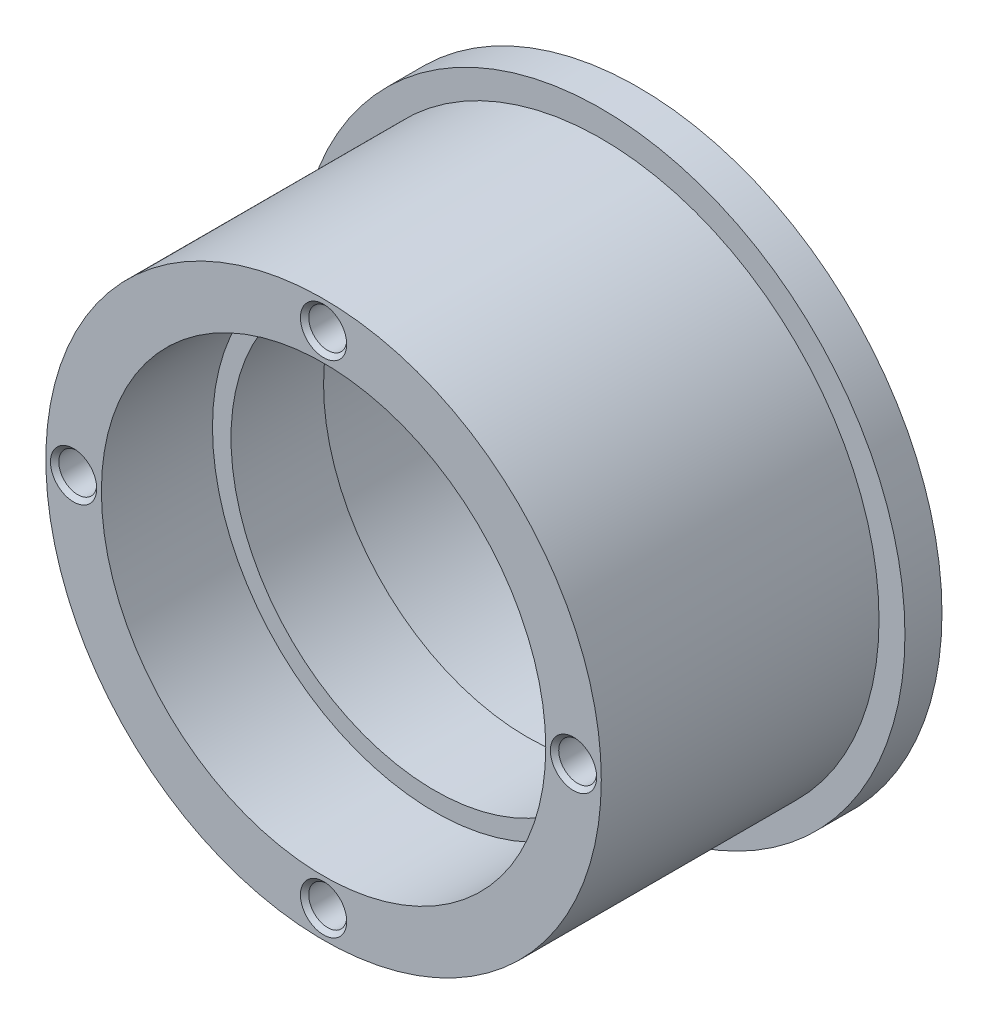
ISO-10303-21;
HEADER;
FILE_DESCRIPTION(('STEP AP214'),'2;1');
FILE_NAME('part.step','',(''),(''),'','','');
FILE_SCHEMA(('AUTOMOTIVE_DESIGN { 1 0 10303 214 1 1 1 1 }'));
ENDSEC;
DATA;
#1=APPLICATION_CONTEXT('core data for automotive mechanical design processes');
#2=APPLICATION_PROTOCOL_DEFINITION('international standard','automotive_design',2000,#1);
#3=PRODUCT_CONTEXT('',#1,'mechanical');
#4=PRODUCT('Part','Part','',(#3));
#5=PRODUCT_RELATED_PRODUCT_CATEGORY('part','',(#4));
#6=PRODUCT_DEFINITION_FORMATION('','',#4);
#7=PRODUCT_DEFINITION_CONTEXT('part definition',#1,'design');
#8=PRODUCT_DEFINITION('design','',#6,#7);
#9=PRODUCT_DEFINITION_SHAPE('','',#8);
#10=(LENGTH_UNIT() NAMED_UNIT(*) SI_UNIT(.MILLI.,.METRE.));
#11=(NAMED_UNIT(*) PLANE_ANGLE_UNIT() SI_UNIT($,.RADIAN.));
#12=(NAMED_UNIT(*) SI_UNIT($,.STERADIAN.) SOLID_ANGLE_UNIT());
#13=UNCERTAINTY_MEASURE_WITH_UNIT(LENGTH_MEASURE(1.E-05),#10,'distance_accuracy_value','');
#14=(GEOMETRIC_REPRESENTATION_CONTEXT(3) GLOBAL_UNCERTAINTY_ASSIGNED_CONTEXT((#13)) GLOBAL_UNIT_ASSIGNED_CONTEXT((#10,
#11,#12)) REPRESENTATION_CONTEXT('',''));
#15=CARTESIAN_POINT('',(0.,0.,0.));
#16=DIRECTION('',(0.,0.,1.));
#17=DIRECTION('',(1.,0.,0.));
#18=AXIS2_PLACEMENT_3D('',#15,#16,#17);
#19=CARTESIAN_POINT('',(0.,13.5,8.5));
#20=DIRECTION('',(0.,0.,1.));
#21=DIRECTION('',(1.,0.,0.));
#22=AXIS2_PLACEMENT_3D('',#19,#20,#21);
#23=CONICAL_SURFACE('',#22,1.25,0.785398162500002);
#24=CARTESIAN_POINT('',(0.,13.5,8.5));
#25=DIRECTION('',(0.,0.,-1.));
#26=DIRECTION('',(1.,0.,0.));
#27=AXIS2_PLACEMENT_3D('',#24,#25,#26);
#28=CIRCLE('',#27,1.25);
#29=CARTESIAN_POINT('',(1.25000000000005,13.5,8.5));
#30=VERTEX_POINT('',#29);
#31=EDGE_CURVE('E164',#30,#30,#28,.T.);
#32=ORIENTED_EDGE('',*,*,#31,.F.);
#33=EDGE_LOOP('',(#32));
#34=FACE_BOUND('',#33,.T.);
#35=CARTESIAN_POINT('',(0.,13.5,8.275));
#36=DIRECTION('',(0.,0.,1.));
#37=DIRECTION('',(1.,0.,0.));
#38=AXIS2_PLACEMENT_3D('',#35,#36,#37);
#39=CIRCLE('',#38,1.025);
#40=CARTESIAN_POINT('',(1.02500000000005,13.5,8.275));
#41=VERTEX_POINT('',#40);
#42=EDGE_CURVE('E11',#41,#41,#39,.T.);
#43=ORIENTED_EDGE('',*,*,#42,.F.);
#44=EDGE_LOOP('',(#43));
#45=FACE_BOUND('',#44,.T.);
#46=ADVANCED_FACE('F16',(#34,#45),#23,.F.);
#47=CARTESIAN_POINT('',(0.,13.5,8.5));
#48=DIRECTION('',(0.,0.,-1.));
#49=DIRECTION('',(-1.,0.,0.));
#50=AXIS2_PLACEMENT_3D('',#47,#48,#49);
#51=CYLINDRICAL_SURFACE('',#50,1.025);
#52=CARTESIAN_POINT('',(0.,13.5,3.5));
#53=DIRECTION('',(0.,0.,1.));
#54=DIRECTION('',(-1.,0.,0.));
#55=AXIS2_PLACEMENT_3D('',#52,#53,#54);
#56=CIRCLE('',#55,1.025);
#57=CARTESIAN_POINT('',(-1.02499999999995,13.5,3.5));
#58=VERTEX_POINT('',#57);
#59=EDGE_CURVE('E27',#58,#58,#56,.T.);
#60=ORIENTED_EDGE('',*,*,#59,.F.);
#61=EDGE_LOOP('',(#60));
#62=FACE_BOUND('',#61,.T.);
#63=ORIENTED_EDGE('',*,*,#42,.T.);
#64=EDGE_LOOP('',(#63));
#65=FACE_BOUND('',#64,.T.);
#66=ADVANCED_FACE('F345',(#62,#65),#51,.F.);
#67=CARTESIAN_POINT('',(0.,13.5,3.5));
#68=DIRECTION('',(0.,0.,1.));
#69=DIRECTION('',(1.,0.,0.));
#70=AXIS2_PLACEMENT_3D('',#67,#68,#69);
#71=CONICAL_SURFACE('',#70,1.025,1.0297442575);
#72=CARTESIAN_POINT('',(0.,13.5,2.88411786549675));
#73=VERTEX_POINT('',#72);
#74=VERTEX_LOOP('',#73);
#75=FACE_BOUND('',#74,.T.);
#76=ORIENTED_EDGE('',*,*,#59,.T.);
#77=EDGE_LOOP('',(#76));
#78=FACE_BOUND('',#77,.T.);
#79=ADVANCED_FACE('F306',(#75,#78),#71,.F.);
#80=CARTESIAN_POINT('',(13.5,0.,8.5));
#81=DIRECTION('',(0.,0.,1.));
#82=DIRECTION('',(1.,0.,0.));
#83=AXIS2_PLACEMENT_3D('',#80,#81,#82);
#84=CONICAL_SURFACE('',#83,1.25,0.7853981625);
#85=CARTESIAN_POINT('',(13.5,0.,8.5));
#86=DIRECTION('',(0.,0.,-1.));
#87=DIRECTION('',(1.,0.,0.));
#88=AXIS2_PLACEMENT_3D('',#85,#86,#87);
#89=CIRCLE('',#88,1.25);
#90=CARTESIAN_POINT('',(14.75,0.,8.5));
#91=VERTEX_POINT('',#90);
#92=EDGE_CURVE('E167',#91,#91,#89,.T.);
#93=ORIENTED_EDGE('',*,*,#92,.F.);
#94=EDGE_LOOP('',(#93));
#95=FACE_BOUND('',#94,.T.);
#96=CARTESIAN_POINT('',(13.5,0.,8.275));
#97=DIRECTION('',(0.,0.,1.));
#98=DIRECTION('',(1.,0.,0.));
#99=AXIS2_PLACEMENT_3D('',#96,#97,#98);
#100=CIRCLE('',#99,1.025);
#101=CARTESIAN_POINT('',(14.525,0.,8.275));
#102=VERTEX_POINT('',#101);
#103=EDGE_CURVE('E144',#102,#102,#100,.T.);
#104=ORIENTED_EDGE('',*,*,#103,.F.);
#105=EDGE_LOOP('',(#104));
#106=FACE_BOUND('',#105,.T.);
#107=ADVANCED_FACE('F300',(#95,#106),#84,.F.);
#108=CARTESIAN_POINT('',(13.5,0.,8.5));
#109=DIRECTION('',(0.,0.,-1.));
#110=DIRECTION('',(-1.,0.,0.));
#111=AXIS2_PLACEMENT_3D('',#108,#109,#110);
#112=CYLINDRICAL_SURFACE('',#111,1.025);
#113=CARTESIAN_POINT('',(13.5,0.,3.5));
#114=DIRECTION('',(0.,0.,1.));
#115=DIRECTION('',(-1.,0.,0.));
#116=AXIS2_PLACEMENT_3D('',#113,#114,#115);
#117=CIRCLE('',#116,1.025);
#118=CARTESIAN_POINT('',(12.475,0.,3.5));
#119=VERTEX_POINT('',#118);
#120=EDGE_CURVE('E146',#119,#119,#117,.T.);
#121=ORIENTED_EDGE('',*,*,#120,.F.);
#122=EDGE_LOOP('',(#121));
#123=FACE_BOUND('',#122,.T.);
#124=ORIENTED_EDGE('',*,*,#103,.T.);
#125=EDGE_LOOP('',(#124));
#126=FACE_BOUND('',#125,.T.);
#127=ADVANCED_FACE('F305',(#123,#126),#112,.F.);
#128=CARTESIAN_POINT('',(13.5,0.,3.5));
#129=DIRECTION('',(0.,0.,1.));
#130=DIRECTION('',(1.,0.,0.));
#131=AXIS2_PLACEMENT_3D('',#128,#129,#130);
#132=CONICAL_SURFACE('',#131,1.025,1.0297442575);
#133=CARTESIAN_POINT('',(13.5,0.,2.88411786549675));
#134=VERTEX_POINT('',#133);
#135=VERTEX_LOOP('',#134);
#136=FACE_BOUND('',#135,.T.);
#137=ORIENTED_EDGE('',*,*,#120,.T.);
#138=EDGE_LOOP('',(#137));
#139=FACE_BOUND('',#138,.T.);
#140=ADVANCED_FACE('F18',(#136,#139),#132,.F.);
#141=CARTESIAN_POINT('',(0.,-13.5,8.5));
#142=DIRECTION('',(0.,0.,1.));
#143=DIRECTION('',(1.,0.,0.));
#144=AXIS2_PLACEMENT_3D('',#141,#142,#143);
#145=CONICAL_SURFACE('',#144,1.25,0.785398162500002);
#146=CARTESIAN_POINT('',(0.,-13.5,8.5));
#147=DIRECTION('',(0.,0.,-1.));
#148=DIRECTION('',(1.,0.,0.));
#149=AXIS2_PLACEMENT_3D('',#146,#147,#148);
#150=CIRCLE('',#149,1.25);
#151=CARTESIAN_POINT('',(1.24999999999998,-13.5,8.5));
#152=VERTEX_POINT('',#151);
#153=EDGE_CURVE('E142',#152,#152,#150,.T.);
#154=ORIENTED_EDGE('',*,*,#153,.F.);
#155=EDGE_LOOP('',(#154));
#156=FACE_BOUND('',#155,.T.);
#157=CARTESIAN_POINT('',(0.,-13.5,8.275));
#158=DIRECTION('',(0.,0.,1.));
#159=DIRECTION('',(1.,0.,0.));
#160=AXIS2_PLACEMENT_3D('',#157,#158,#159);
#161=CIRCLE('',#160,1.025);
#162=CARTESIAN_POINT('',(1.02499999999998,-13.5,8.275));
#163=VERTEX_POINT('',#162);
#164=EDGE_CURVE('E151',#163,#163,#161,.T.);
#165=ORIENTED_EDGE('',*,*,#164,.F.);
#166=EDGE_LOOP('',(#165));
#167=FACE_BOUND('',#166,.T.);
#168=ADVANCED_FACE('F321',(#156,#167),#145,.F.);
#169=CARTESIAN_POINT('',(0.,-13.5,8.5));
#170=DIRECTION('',(0.,0.,-1.));
#171=DIRECTION('',(-1.,0.,0.));
#172=AXIS2_PLACEMENT_3D('',#169,#170,#171);
#173=CYLINDRICAL_SURFACE('',#172,1.025);
#174=CARTESIAN_POINT('',(0.,-13.5,3.5));
#175=DIRECTION('',(0.,0.,1.));
#176=DIRECTION('',(-1.,0.,0.));
#177=AXIS2_PLACEMENT_3D('',#174,#175,#176);
#178=CIRCLE('',#177,1.025);
#179=CARTESIAN_POINT('',(-1.02500000000002,-13.5,3.5));
#180=VERTEX_POINT('',#179);
#181=EDGE_CURVE('E148',#180,#180,#178,.T.);
#182=ORIENTED_EDGE('',*,*,#181,.F.);
#183=EDGE_LOOP('',(#182));
#184=FACE_BOUND('',#183,.T.);
#185=ORIENTED_EDGE('',*,*,#164,.T.);
#186=EDGE_LOOP('',(#185));
#187=FACE_BOUND('',#186,.T.);
#188=ADVANCED_FACE('F315',(#184,#187),#173,.F.);
#189=CARTESIAN_POINT('',(0.,-13.5,3.5));
#190=DIRECTION('',(0.,0.,1.));
#191=DIRECTION('',(1.,0.,0.));
#192=AXIS2_PLACEMENT_3D('',#189,#190,#191);
#193=CONICAL_SURFACE('',#192,1.025,1.0297442575);
#194=CARTESIAN_POINT('',(0.,-13.5,2.88411786549675));
#195=VERTEX_POINT('',#194);
#196=VERTEX_LOOP('',#195);
#197=FACE_BOUND('',#196,.T.);
#198=ORIENTED_EDGE('',*,*,#181,.T.);
#199=EDGE_LOOP('',(#198));
#200=FACE_BOUND('',#199,.T.);
#201=ADVANCED_FACE('F320',(#197,#200),#193,.F.);
#202=CARTESIAN_POINT('',(-13.5,0.,8.5));
#203=DIRECTION('',(0.,0.,1.));
#204=DIRECTION('',(1.,0.,0.));
#205=AXIS2_PLACEMENT_3D('',#202,#203,#204);
#206=CONICAL_SURFACE('',#205,1.25,0.7853981625);
#207=CARTESIAN_POINT('',(-13.5,0.,8.5));
#208=DIRECTION('',(0.,0.,-1.));
#209=DIRECTION('',(1.,0.,0.));
#210=AXIS2_PLACEMENT_3D('',#207,#208,#209);
#211=CIRCLE('',#210,1.25);
#212=CARTESIAN_POINT('',(-12.25,0.,8.5));
#213=VERTEX_POINT('',#212);
#214=EDGE_CURVE('E172',#213,#213,#211,.T.);
#215=ORIENTED_EDGE('',*,*,#214,.F.);
#216=EDGE_LOOP('',(#215));
#217=FACE_BOUND('',#216,.T.);
#218=CARTESIAN_POINT('',(-13.5,0.,8.275));
#219=DIRECTION('',(0.,0.,1.));
#220=DIRECTION('',(1.,0.,0.));
#221=AXIS2_PLACEMENT_3D('',#218,#219,#220);
#222=CIRCLE('',#221,1.025);
#223=CARTESIAN_POINT('',(-12.475,0.,8.275));
#224=VERTEX_POINT('',#223);
#225=EDGE_CURVE('E87',#224,#224,#222,.T.);
#226=ORIENTED_EDGE('',*,*,#225,.F.);
#227=EDGE_LOOP('',(#226));
#228=FACE_BOUND('',#227,.T.);
#229=ADVANCED_FACE('F390',(#217,#228),#206,.F.);
#230=CARTESIAN_POINT('',(-13.5,0.,8.5));
#231=DIRECTION('',(0.,0.,-1.));
#232=DIRECTION('',(-1.,0.,0.));
#233=AXIS2_PLACEMENT_3D('',#230,#231,#232);
#234=CYLINDRICAL_SURFACE('',#233,1.025);
#235=CARTESIAN_POINT('',(-13.5,0.,3.5));
#236=DIRECTION('',(0.,0.,1.));
#237=DIRECTION('',(-1.,0.,0.));
#238=AXIS2_PLACEMENT_3D('',#235,#236,#237);
#239=CIRCLE('',#238,1.025);
#240=CARTESIAN_POINT('',(-14.525,0.,3.5));
#241=VERTEX_POINT('',#240);
#242=EDGE_CURVE('E96',#241,#241,#239,.T.);
#243=ORIENTED_EDGE('',*,*,#242,.F.);
#244=EDGE_LOOP('',(#243));
#245=FACE_BOUND('',#244,.T.);
#246=ORIENTED_EDGE('',*,*,#225,.T.);
#247=EDGE_LOOP('',(#246));
#248=FACE_BOUND('',#247,.T.);
#249=ADVANCED_FACE('F384',(#245,#248),#234,.F.);
#250=CARTESIAN_POINT('',(-13.5,0.,3.5));
#251=DIRECTION('',(0.,0.,1.));
#252=DIRECTION('',(1.,0.,0.));
#253=AXIS2_PLACEMENT_3D('',#250,#251,#252);
#254=CONICAL_SURFACE('',#253,1.025,1.0297442575);
#255=CARTESIAN_POINT('',(-13.5,0.,2.88411786549675));
#256=VERTEX_POINT('',#255);
#257=VERTEX_LOOP('',#256);
#258=FACE_BOUND('',#257,.T.);
#259=ORIENTED_EDGE('',*,*,#242,.T.);
#260=EDGE_LOOP('',(#259));
#261=FACE_BOUND('',#260,.T.);
#262=ADVANCED_FACE('F389',(#258,#261),#254,.F.);
#263=CARTESIAN_POINT('',(0.,0.,-2.5));
#264=DIRECTION('',(0.,0.,-1.));
#265=DIRECTION('',(-1.,0.,0.));
#266=AXIS2_PLACEMENT_3D('',#263,#264,#265);
#267=CYLINDRICAL_SURFACE('',#266,12.);
#268=CARTESIAN_POINT('',(0.,0.,-8.5));
#269=DIRECTION('',(0.,0.,-1.));
#270=DIRECTION('',(1.,0.,0.));
#271=AXIS2_PLACEMENT_3D('',#268,#269,#270);
#272=CIRCLE('',#271,12.);
#273=CARTESIAN_POINT('',(12.,0.,-8.5));
#274=VERTEX_POINT('',#273);
#275=EDGE_CURVE('E125',#274,#274,#272,.T.);
#276=ORIENTED_EDGE('',*,*,#275,.T.);
#277=EDGE_LOOP('',(#276));
#278=FACE_BOUND('',#277,.T.);
#279=CARTESIAN_POINT('',(0.,0.,-2.5));
#280=DIRECTION('',(0.,0.,1.));
#281=DIRECTION('',(1.,0.,0.));
#282=AXIS2_PLACEMENT_3D('',#279,#280,#281);
#283=CIRCLE('',#282,12.);
#284=CARTESIAN_POINT('',(12.,0.,-2.5));
#285=VERTEX_POINT('',#284);
#286=EDGE_CURVE('E137',#285,#285,#283,.T.);
#287=ORIENTED_EDGE('',*,*,#286,.T.);
#288=EDGE_LOOP('',(#287));
#289=FACE_BOUND('',#288,.T.);
#290=ADVANCED_FACE('F126',(#278,#289),#267,.F.);
#291=CARTESIAN_POINT('',(0.,0.,-2.5));
#292=DIRECTION('',(0.,0.,-1.));
#293=DIRECTION('',(0.,-1.,0.));
#294=AXIS2_PLACEMENT_3D('',#291,#292,#293);
#295=PLANE('',#294);
#296=CARTESIAN_POINT('',(0.,0.,-2.5));
#297=DIRECTION('',(0.,0.,1.));
#298=DIRECTION('',(-1.,0.,0.));
#299=AXIS2_PLACEMENT_3D('',#296,#297,#298);
#300=CIRCLE('',#299,11.);
#301=CARTESIAN_POINT('',(-11.,0.,-2.5));
#302=VERTEX_POINT('',#301);
#303=EDGE_CURVE('E154',#302,#302,#300,.T.);
#304=ORIENTED_EDGE('',*,*,#303,.T.);
#305=EDGE_LOOP('',(#304));
#306=FACE_BOUND('',#305,.T.);
#307=ORIENTED_EDGE('',*,*,#286,.F.);
#308=EDGE_LOOP('',(#307));
#309=FACE_BOUND('',#308,.T.);
#310=ADVANCED_FACE('F411',(#306,#309),#295,.T.);
#311=CARTESIAN_POINT('',(0.,0.,2.5));
#312=DIRECTION('',(0.,0.,1.));
#313=DIRECTION('',(1.,0.,0.));
#314=AXIS2_PLACEMENT_3D('',#311,#312,#313);
#315=CYLINDRICAL_SURFACE('',#314,12.);
#316=CARTESIAN_POINT('',(0.,0.,8.5));
#317=DIRECTION('',(0.,0.,1.));
#318=DIRECTION('',(1.,0.,0.));
#319=AXIS2_PLACEMENT_3D('',#316,#317,#318);
#320=CIRCLE('',#319,12.);
#321=CARTESIAN_POINT('',(12.,0.,8.5));
#322=VERTEX_POINT('',#321);
#323=EDGE_CURVE('E163',#322,#322,#320,.T.);
#324=ORIENTED_EDGE('',*,*,#323,.T.);
#325=EDGE_LOOP('',(#324));
#326=FACE_BOUND('',#325,.T.);
#327=CARTESIAN_POINT('',(0.,0.,2.5));
#328=DIRECTION('',(0.,0.,-1.));
#329=DIRECTION('',(1.,0.,0.));
#330=AXIS2_PLACEMENT_3D('',#327,#328,#329);
#331=CIRCLE('',#330,12.);
#332=CARTESIAN_POINT('',(12.,0.,2.5));
#333=VERTEX_POINT('',#332);
#334=EDGE_CURVE('E130',#333,#333,#331,.T.);
#335=ORIENTED_EDGE('',*,*,#334,.T.);
#336=EDGE_LOOP('',(#335));
#337=FACE_BOUND('',#336,.T.);
#338=ADVANCED_FACE('F291',(#326,#337),#315,.F.);
#339=CARTESIAN_POINT('',(0.,0.,2.5));
#340=DIRECTION('',(0.,0.,1.));
#341=DIRECTION('',(1.,0.,0.));
#342=AXIS2_PLACEMENT_3D('',#339,#340,#341);
#343=PLANE('',#342);
#344=CARTESIAN_POINT('',(0.,0.,2.5));
#345=DIRECTION('',(0.,0.,-1.));
#346=DIRECTION('',(1.,0.,0.));
#347=AXIS2_PLACEMENT_3D('',#344,#345,#346);
#348=CIRCLE('',#347,11.);
#349=CARTESIAN_POINT('',(11.,0.,2.5));
#350=VERTEX_POINT('',#349);
#351=EDGE_CURVE('E159',#350,#350,#348,.T.);
#352=ORIENTED_EDGE('',*,*,#351,.T.);
#353=EDGE_LOOP('',(#352));
#354=FACE_BOUND('',#353,.T.);
#355=ORIENTED_EDGE('',*,*,#334,.F.);
#356=EDGE_LOOP('',(#355));
#357=FACE_BOUND('',#356,.T.);
#358=ADVANCED_FACE('F285',(#354,#357),#343,.T.);
#359=CARTESIAN_POINT('',(0.,0.,-6.5));
#360=DIRECTION('',(0.,0.,-1.));
#361=DIRECTION('',(0.,-1.,0.));
#362=AXIS2_PLACEMENT_3D('',#359,#360,#361);
#363=PLANE('',#362);
#364=CARTESIAN_POINT('',(0.,0.,-6.5));
#365=DIRECTION('',(0.,0.,-1.));
#366=DIRECTION('',(1.,0.,0.));
#367=AXIS2_PLACEMENT_3D('',#364,#365,#366);
#368=CIRCLE('',#367,16.4);
#369=CARTESIAN_POINT('',(16.4,0.,-6.5));
#370=VERTEX_POINT('',#369);
#371=EDGE_CURVE('E20',#370,#370,#368,.T.);
#372=ORIENTED_EDGE('',*,*,#371,.F.);
#373=EDGE_LOOP('',(#372));
#374=FACE_BOUND('',#373,.T.);
#375=CARTESIAN_POINT('',(0.,0.,-6.5));
#376=DIRECTION('',(0.,0.,1.));
#377=DIRECTION('',(1.,0.,0.));
#378=AXIS2_PLACEMENT_3D('',#375,#376,#377);
#379=CIRCLE('',#378,15.);
#380=CARTESIAN_POINT('',(15.,0.,-6.5));
#381=VERTEX_POINT('',#380);
#382=EDGE_CURVE('E158',#381,#381,#379,.T.);
#383=ORIENTED_EDGE('',*,*,#382,.F.);
#384=EDGE_LOOP('',(#383));
#385=FACE_BOUND('',#384,.T.);
#386=ADVANCED_FACE('F290',(#374,#385),#363,.F.);
#387=CARTESIAN_POINT('',(0.,0.,-8.5));
#388=DIRECTION('',(0.,0.,-1.));
#389=DIRECTION('',(0.,-1.,0.));
#390=AXIS2_PLACEMENT_3D('',#387,#388,#389);
#391=PLANE('',#390);
#392=CARTESIAN_POINT('',(0.,0.,-8.5));
#393=DIRECTION('',(0.,0.,-1.));
#394=DIRECTION('',(1.,0.,0.));
#395=AXIS2_PLACEMENT_3D('',#392,#393,#394);
#396=CIRCLE('',#395,16.4);
#397=CARTESIAN_POINT('',(16.4,0.,-8.5));
#398=VERTEX_POINT('',#397);
#399=EDGE_CURVE('E139',#398,#398,#396,.T.);
#400=ORIENTED_EDGE('',*,*,#399,.T.);
#401=EDGE_LOOP('',(#400));
#402=FACE_BOUND('',#401,.T.);
#403=ORIENTED_EDGE('',*,*,#275,.F.);
#404=EDGE_LOOP('',(#403));
#405=FACE_BOUND('',#404,.T.);
#406=ADVANCED_FACE('F336',(#402,#405),#391,.T.);
#407=CARTESIAN_POINT('',(0.,0.,-8.5));
#408=DIRECTION('',(0.,0.,1.));
#409=DIRECTION('',(1.,0.,0.));
#410=AXIS2_PLACEMENT_3D('',#407,#408,#409);
#411=CYLINDRICAL_SURFACE('',#410,16.4);
#412=ORIENTED_EDGE('',*,*,#371,.T.);
#413=EDGE_LOOP('',(#412));
#414=FACE_BOUND('',#413,.T.);
#415=ORIENTED_EDGE('',*,*,#399,.F.);
#416=EDGE_LOOP('',(#415));
#417=FACE_BOUND('',#416,.T.);
#418=ADVANCED_FACE('F330',(#414,#417),#411,.T.);
#419=CARTESIAN_POINT('',(0.,0.,8.5));
#420=DIRECTION('',(0.,0.,1.));
#421=DIRECTION('',(1.,0.,0.));
#422=AXIS2_PLACEMENT_3D('',#419,#420,#421);
#423=PLANE('',#422);
#424=CARTESIAN_POINT('',(0.,0.,8.5));
#425=DIRECTION('',(0.,0.,1.));
#426=DIRECTION('',(1.,0.,0.));
#427=AXIS2_PLACEMENT_3D('',#424,#425,#426);
#428=CIRCLE('',#427,15.);
#429=CARTESIAN_POINT('',(15.,0.,8.5));
#430=VERTEX_POINT('',#429);
#431=EDGE_CURVE('E168',#430,#430,#428,.T.);
#432=ORIENTED_EDGE('',*,*,#431,.T.);
#433=EDGE_LOOP('',(#432));
#434=FACE_BOUND('',#433,.T.);
#435=ORIENTED_EDGE('',*,*,#323,.F.);
#436=EDGE_LOOP('',(#435));
#437=FACE_BOUND('',#436,.T.);
#438=ORIENTED_EDGE('',*,*,#214,.T.);
#439=EDGE_LOOP('',(#438));
#440=FACE_BOUND('',#439,.T.);
#441=ORIENTED_EDGE('',*,*,#153,.T.);
#442=EDGE_LOOP('',(#441));
#443=FACE_BOUND('',#442,.T.);
#444=ORIENTED_EDGE('',*,*,#92,.T.);
#445=EDGE_LOOP('',(#444));
#446=FACE_BOUND('',#445,.T.);
#447=ORIENTED_EDGE('',*,*,#31,.T.);
#448=EDGE_LOOP('',(#447));
#449=FACE_BOUND('',#448,.T.);
#450=ADVANCED_FACE('F335',(#434,#437,#440,#443,#446,#449),#423,.T.);
#451=CARTESIAN_POINT('',(0.,0.,-6.5));
#452=DIRECTION('',(0.,0.,1.));
#453=DIRECTION('',(1.,0.,0.));
#454=AXIS2_PLACEMENT_3D('',#451,#452,#453);
#455=CYLINDRICAL_SURFACE('',#454,15.);
#456=ORIENTED_EDGE('',*,*,#431,.F.);
#457=EDGE_LOOP('',(#456));
#458=FACE_BOUND('',#457,.T.);
#459=ORIENTED_EDGE('',*,*,#382,.T.);
#460=EDGE_LOOP('',(#459));
#461=FACE_BOUND('',#460,.T.);
#462=ADVANCED_FACE('F276',(#458,#461),#455,.T.);
#463=CARTESIAN_POINT('',(0.,0.,-6.5));
#464=DIRECTION('',(0.,0.,1.));
#465=DIRECTION('',(1.,0.,0.));
#466=AXIS2_PLACEMENT_3D('',#463,#464,#465);
#467=CYLINDRICAL_SURFACE('',#466,11.);
#468=ORIENTED_EDGE('',*,*,#303,.F.);
#469=EDGE_LOOP('',(#468));
#470=FACE_BOUND('',#469,.T.);
#471=ORIENTED_EDGE('',*,*,#351,.F.);
#472=EDGE_LOOP('',(#471));
#473=FACE_BOUND('',#472,.T.);
#474=ADVANCED_FACE('F270',(#470,#473),#467,.F.);
#475=CLOSED_SHELL('',(#46,#66,#79,#107,#127,#140,#168,#188,#201,#229,#249,#262,#290,#310,#338,
#358,#386,#406,#418,#450,#462,#474));
#476=MANIFOLD_SOLID_BREP('B1',#475);
#477=ADVANCED_BREP_SHAPE_REPRESENTATION('',(#18,#476),#14);
#478=SHAPE_DEFINITION_REPRESENTATION(#9,#477);
ENDSEC;
END-ISO-10303-21;
